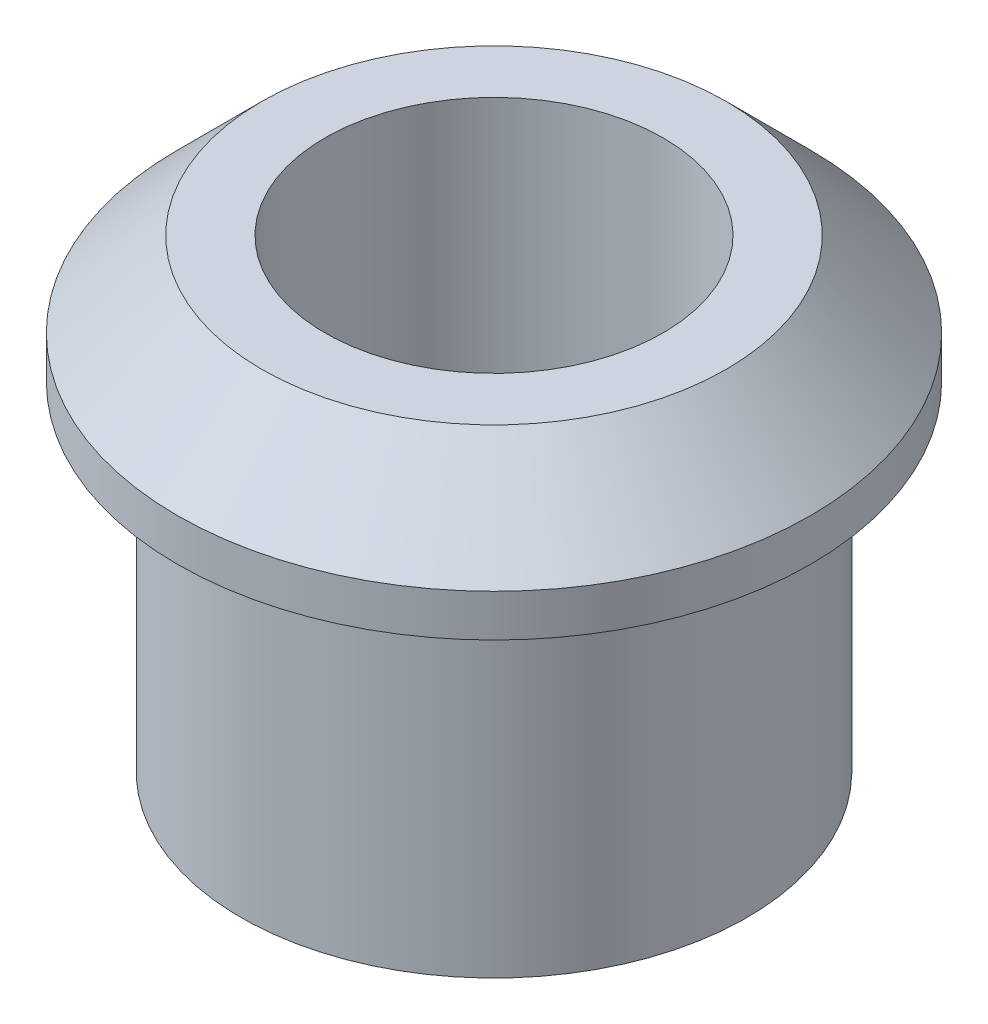
ISO-10303-21;
HEADER;
FILE_DESCRIPTION(('STEP AP214'),'2;1');
FILE_NAME('part.step','',(''),(''),'','','');
FILE_SCHEMA(('AUTOMOTIVE_DESIGN { 1 0 10303 214 1 1 1 1 }'));
ENDSEC;
DATA;
#1=APPLICATION_CONTEXT('core data for automotive mechanical design processes');
#2=APPLICATION_PROTOCOL_DEFINITION('international standard','automotive_design',2000,#1);
#3=PRODUCT_CONTEXT('',#1,'mechanical');
#4=PRODUCT('Part','Part','',(#3));
#5=PRODUCT_RELATED_PRODUCT_CATEGORY('part','',(#4));
#6=PRODUCT_DEFINITION_FORMATION('','',#4);
#7=PRODUCT_DEFINITION_CONTEXT('part definition',#1,'design');
#8=PRODUCT_DEFINITION('design','',#6,#7);
#9=PRODUCT_DEFINITION_SHAPE('','',#8);
#10=(LENGTH_UNIT() NAMED_UNIT(*) SI_UNIT(.MILLI.,.METRE.));
#11=(NAMED_UNIT(*) PLANE_ANGLE_UNIT() SI_UNIT($,.RADIAN.));
#12=(NAMED_UNIT(*) SI_UNIT($,.STERADIAN.) SOLID_ANGLE_UNIT());
#13=UNCERTAINTY_MEASURE_WITH_UNIT(LENGTH_MEASURE(1.E-05),#10,'distance_accuracy_value','');
#14=(GEOMETRIC_REPRESENTATION_CONTEXT(3) GLOBAL_UNCERTAINTY_ASSIGNED_CONTEXT((#13)) GLOBAL_UNIT_ASSIGNED_CONTEXT((#10,
#11,#12)) REPRESENTATION_CONTEXT('',''));
#15=CARTESIAN_POINT('',(0.,0.,0.));
#16=DIRECTION('',(0.,0.,1.));
#17=DIRECTION('',(1.,0.,0.));
#18=AXIS2_PLACEMENT_3D('',#15,#16,#17);
#19=CARTESIAN_POINT('',(5.995,0.,0.));
#20=DIRECTION('',(0.,-1.,0.));
#21=DIRECTION('',(0.,0.,-1.));
#22=AXIS2_PLACEMENT_3D('',#19,#20,#21);
#23=PLANE('',#22);
#24=CARTESIAN_POINT('',(0.,0.,0.));
#25=DIRECTION('',(0.,-1.,0.));
#26=DIRECTION('',(0.,0.,-1.));
#27=AXIS2_PLACEMENT_3D('',#24,#25,#26);
#28=CIRCLE('',#27,5.995);
#29=CARTESIAN_POINT('',(0.,0.,-5.995));
#30=VERTEX_POINT('',#29);
#31=EDGE_CURVE('E74',#30,#30,#28,.T.);
#32=ORIENTED_EDGE('',*,*,#31,.T.);
#33=EDGE_LOOP('',(#32));
#34=FACE_BOUND('',#33,.T.);
#35=CARTESIAN_POINT('',(0.,0.,0.));
#36=DIRECTION('',(0.,-1.,0.));
#37=DIRECTION('',(0.,0.,-1.));
#38=AXIS2_PLACEMENT_3D('',#35,#36,#37);
#39=CIRCLE('',#38,4.005);
#40=CARTESIAN_POINT('',(0.,0.,-4.005));
#41=VERTEX_POINT('',#40);
#42=EDGE_CURVE('E10',#41,#41,#39,.T.);
#43=ORIENTED_EDGE('',*,*,#42,.F.);
#44=EDGE_LOOP('',(#43));
#45=FACE_BOUND('',#44,.T.);
#46=ADVANCED_FACE('F43',(#34,#45),#23,.T.);
#47=CARTESIAN_POINT('',(0.,0.,0.));
#48=DIRECTION('',(0.,-1.,0.));
#49=DIRECTION('',(0.,0.,-1.));
#50=AXIS2_PLACEMENT_3D('',#47,#48,#49);
#51=CYLINDRICAL_SURFACE('',#50,4.005);
#52=ORIENTED_EDGE('',*,*,#42,.T.);
#53=EDGE_LOOP('',(#52));
#54=FACE_BOUND('',#53,.T.);
#55=CARTESIAN_POINT('',(0.,11.,0.));
#56=DIRECTION('',(0.,-1.,0.));
#57=DIRECTION('',(0.,0.,-1.));
#58=AXIS2_PLACEMENT_3D('',#55,#56,#57);
#59=CIRCLE('',#58,4.005);
#60=CARTESIAN_POINT('',(0.,11.,-4.005));
#61=VERTEX_POINT('',#60);
#62=EDGE_CURVE('E50',#61,#61,#59,.T.);
#63=ORIENTED_EDGE('',*,*,#62,.F.);
#64=EDGE_LOOP('',(#63));
#65=FACE_BOUND('',#64,.T.);
#66=ADVANCED_FACE('F93',(#54,#65),#51,.F.);
#67=CARTESIAN_POINT('',(4.005,11.,0.));
#68=DIRECTION('',(0.,1.,0.));
#69=DIRECTION('',(0.,0.,1.));
#70=AXIS2_PLACEMENT_3D('',#67,#68,#69);
#71=PLANE('',#70);
#72=ORIENTED_EDGE('',*,*,#62,.T.);
#73=EDGE_LOOP('',(#72));
#74=FACE_BOUND('',#73,.T.);
#75=CARTESIAN_POINT('',(0.,11.,0.));
#76=DIRECTION('',(0.,-1.,0.));
#77=DIRECTION('',(0.,0.,-1.));
#78=AXIS2_PLACEMENT_3D('',#75,#76,#77);
#79=CIRCLE('',#78,5.5);
#80=CARTESIAN_POINT('',(0.,11.,-5.5));
#81=VERTEX_POINT('',#80);
#82=EDGE_CURVE('E55',#81,#81,#79,.T.);
#83=ORIENTED_EDGE('',*,*,#82,.F.);
#84=EDGE_LOOP('',(#83));
#85=FACE_BOUND('',#84,.T.);
#86=ADVANCED_FACE('F97',(#74,#85),#71,.T.);
#87=CARTESIAN_POINT('',(0.,9.00000000000001,0.));
#88=DIRECTION('',(0.,-1.,0.));
#89=DIRECTION('',(0.,0.,-1.));
#90=AXIS2_PLACEMENT_3D('',#87,#88,#89);
#91=CONICAL_SURFACE('',#90,7.5,0.78539816339745);
#92=ORIENTED_EDGE('',*,*,#82,.T.);
#93=EDGE_LOOP('',(#92));
#94=FACE_BOUND('',#93,.T.);
#95=CARTESIAN_POINT('',(0.,9.00000000000001,0.));
#96=DIRECTION('',(0.,-1.,0.));
#97=DIRECTION('',(0.,0.,-1.));
#98=AXIS2_PLACEMENT_3D('',#95,#96,#97);
#99=CIRCLE('',#98,7.5);
#100=CARTESIAN_POINT('',(0.,9.00000000000001,-7.5));
#101=VERTEX_POINT('',#100);
#102=EDGE_CURVE('E60',#101,#101,#99,.T.);
#103=ORIENTED_EDGE('',*,*,#102,.F.);
#104=EDGE_LOOP('',(#103));
#105=FACE_BOUND('',#104,.T.);
#106=ADVANCED_FACE('F101',(#94,#105),#91,.T.);
#107=CARTESIAN_POINT('',(0.,0.,0.));
#108=DIRECTION('',(0.,-1.,0.));
#109=DIRECTION('',(0.,0.,-1.));
#110=AXIS2_PLACEMENT_3D('',#107,#108,#109);
#111=CYLINDRICAL_SURFACE('',#110,7.5);
#112=ORIENTED_EDGE('',*,*,#102,.T.);
#113=EDGE_LOOP('',(#112));
#114=FACE_BOUND('',#113,.T.);
#115=CARTESIAN_POINT('',(0.,8.,0.));
#116=DIRECTION('',(0.,-1.,0.));
#117=DIRECTION('',(0.,0.,-1.));
#118=AXIS2_PLACEMENT_3D('',#115,#116,#117);
#119=CIRCLE('',#118,7.5);
#120=CARTESIAN_POINT('',(0.,8.,-7.5));
#121=VERTEX_POINT('',#120);
#122=EDGE_CURVE('E66',#121,#121,#119,.T.);
#123=ORIENTED_EDGE('',*,*,#122,.F.);
#124=EDGE_LOOP('',(#123));
#125=FACE_BOUND('',#124,.T.);
#126=ADVANCED_FACE('F89',(#114,#125),#111,.T.);
#127=CARTESIAN_POINT('',(7.5,8.,0.));
#128=DIRECTION('',(0.,-1.,0.));
#129=DIRECTION('',(0.,0.,-1.));
#130=AXIS2_PLACEMENT_3D('',#127,#128,#129);
#131=PLANE('',#130);
#132=ORIENTED_EDGE('',*,*,#122,.T.);
#133=EDGE_LOOP('',(#132));
#134=FACE_BOUND('',#133,.T.);
#135=CARTESIAN_POINT('',(0.,8.,0.));
#136=DIRECTION('',(0.,-1.,0.));
#137=DIRECTION('',(0.,0.,-1.));
#138=AXIS2_PLACEMENT_3D('',#135,#136,#137);
#139=CIRCLE('',#138,5.995);
#140=CARTESIAN_POINT('',(0.,8.,-5.995));
#141=VERTEX_POINT('',#140);
#142=EDGE_CURVE('E70',#141,#141,#139,.T.);
#143=ORIENTED_EDGE('',*,*,#142,.F.);
#144=EDGE_LOOP('',(#143));
#145=FACE_BOUND('',#144,.T.);
#146=ADVANCED_FACE('F83',(#134,#145),#131,.T.);
#147=CARTESIAN_POINT('',(0.,0.,0.));
#148=DIRECTION('',(0.,-1.,0.));
#149=DIRECTION('',(0.,0.,-1.));
#150=AXIS2_PLACEMENT_3D('',#147,#148,#149);
#151=CYLINDRICAL_SURFACE('',#150,5.995);
#152=ORIENTED_EDGE('',*,*,#142,.T.);
#153=EDGE_LOOP('',(#152));
#154=FACE_BOUND('',#153,.T.);
#155=ORIENTED_EDGE('',*,*,#31,.F.);
#156=EDGE_LOOP('',(#155));
#157=FACE_BOUND('',#156,.T.);
#158=ADVANCED_FACE('F81',(#154,#157),#151,.T.);
#159=CLOSED_SHELL('',(#46,#66,#86,#106,#126,#146,#158));
#160=MANIFOLD_SOLID_BREP('B2',#159);
#161=ADVANCED_BREP_SHAPE_REPRESENTATION('',(#18,#160),#14);
#162=SHAPE_DEFINITION_REPRESENTATION(#9,#161);
ENDSEC;
END-ISO-10303-21;
